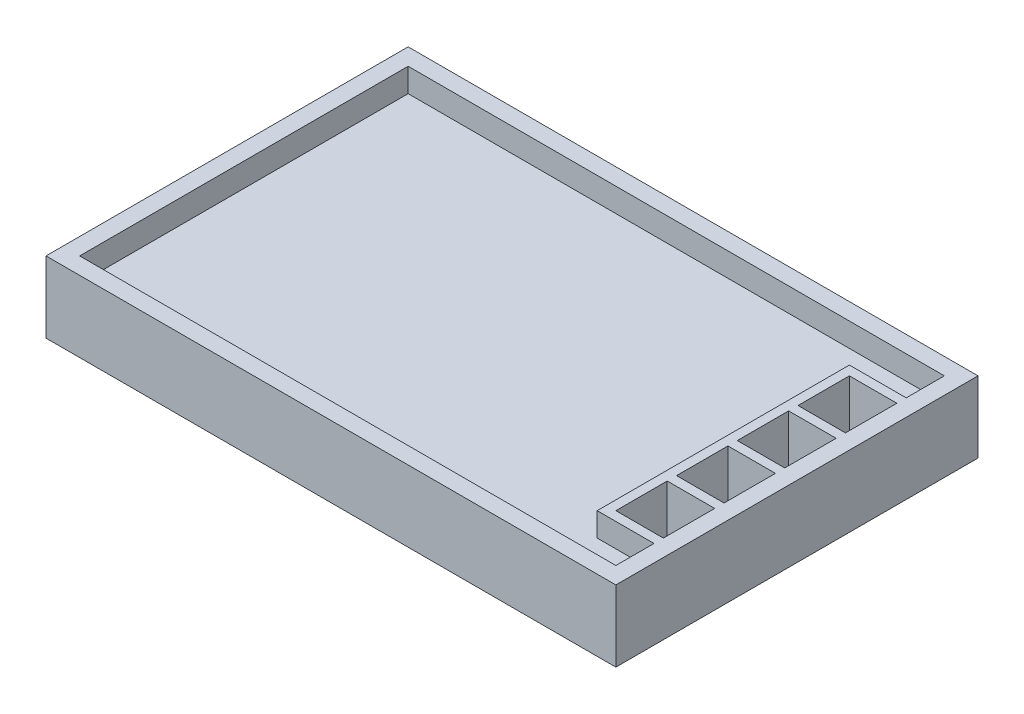
ISO-10303-21;
HEADER;
FILE_DESCRIPTION(('STEP AP214'),'2;1');
FILE_NAME('part.step','',(''),(''),'','','');
FILE_SCHEMA(('AUTOMOTIVE_DESIGN { 1 0 10303 214 1 1 1 1 }'));
ENDSEC;
DATA;
#1=APPLICATION_CONTEXT('core data for automotive mechanical design processes');
#2=APPLICATION_PROTOCOL_DEFINITION('international standard','automotive_design',2000,#1);
#3=PRODUCT_CONTEXT('',#1,'mechanical');
#4=PRODUCT('Part','Part','',(#3));
#5=PRODUCT_RELATED_PRODUCT_CATEGORY('part','',(#4));
#6=PRODUCT_DEFINITION_FORMATION('','',#4);
#7=PRODUCT_DEFINITION_CONTEXT('part definition',#1,'design');
#8=PRODUCT_DEFINITION('design','',#6,#7);
#9=PRODUCT_DEFINITION_SHAPE('','',#8);
#10=(LENGTH_UNIT() NAMED_UNIT(*) SI_UNIT(.MILLI.,.METRE.));
#11=(NAMED_UNIT(*) PLANE_ANGLE_UNIT() SI_UNIT($,.RADIAN.));
#12=(NAMED_UNIT(*) SI_UNIT($,.STERADIAN.) SOLID_ANGLE_UNIT());
#13=UNCERTAINTY_MEASURE_WITH_UNIT(LENGTH_MEASURE(1.E-05),#10,'distance_accuracy_value','');
#14=(GEOMETRIC_REPRESENTATION_CONTEXT(3) GLOBAL_UNCERTAINTY_ASSIGNED_CONTEXT((#13)) GLOBAL_UNIT_ASSIGNED_CONTEXT((#10,
#11,#12)) REPRESENTATION_CONTEXT('',''));
#15=CARTESIAN_POINT('',(0.,0.,0.));
#16=DIRECTION('',(0.,0.,1.));
#17=DIRECTION('',(1.,0.,0.));
#18=AXIS2_PLACEMENT_3D('',#15,#16,#17);
#19=CARTESIAN_POINT('',(319.157180973326,-723.480399595529,-250.416472916478));
#20=DIRECTION('',(1.,0.,0.));
#21=DIRECTION('',(0.,0.,-1.));
#22=AXIS2_PLACEMENT_3D('',#19,#20,#21);
#23=PLANE('',#22);
#24=DIRECTION('',(0.,-1.,0.));
#25=VECTOR('',#24,1.);
#26=CARTESIAN_POINT('',(319.157180973326,276.565869188517,-209.616472916478));
#27=LINE('',#26,#25);
#28=CARTESIAN_POINT('',(319.157180973326,0.,-209.616472916478));
#29=VERTEX_POINT('',#28);
#30=CARTESIAN_POINT('',(319.157180973326,-25.4,-209.616472916478));
#31=VERTEX_POINT('',#30);
#32=EDGE_CURVE('E305',#29,#31,#27,.T.);
#33=ORIENTED_EDGE('',*,*,#32,.F.);
#34=DIRECTION('',(0.,0.,-1.));
#35=VECTOR('',#34,1.);
#36=CARTESIAN_POINT('',(319.157180973326,0.,-250.416472916478));
#37=LINE('',#36,#35);
#38=CARTESIAN_POINT('',(319.157180973326,0.,-250.416472916478));
#39=VERTEX_POINT('',#38);
#40=EDGE_CURVE('E392',#29,#39,#37,.T.);
#41=ORIENTED_EDGE('',*,*,#40,.T.);
#42=DIRECTION('',(0.,1.,0.));
#43=VECTOR('',#42,1.);
#44=CARTESIAN_POINT('',(319.157180973326,-723.480399595529,-250.416472916478));
#45=LINE('',#44,#43);
#46=CARTESIAN_POINT('',(319.157180973326,-25.4,-250.416472916478));
#47=VERTEX_POINT('',#46);
#48=EDGE_CURVE('E409',#47,#39,#45,.T.);
#49=ORIENTED_EDGE('',*,*,#48,.F.);
#50=DIRECTION('',(0.,0.,1.));
#51=VECTOR('',#50,1.);
#52=CARTESIAN_POINT('',(319.157180973326,-25.4,-250.416472916478));
#53=LINE('',#52,#51);
#54=EDGE_CURVE('E374',#47,#31,#53,.T.);
#55=ORIENTED_EDGE('',*,*,#54,.T.);
#56=EDGE_LOOP('',(#33,#41,#49,#55));
#57=FACE_BOUND('',#56,.T.);
#58=ADVANCED_FACE('F37',(#57),#23,.F.);
#59=DIRECTION('',(0.,-1.,0.));
#60=VECTOR('',#59,1.);
#61=CARTESIAN_POINT('',(319.157180973326,276.565869188517,60.1835270835217));
#62=LINE('',#61,#60);
#63=CARTESIAN_POINT('',(319.157180973326,0.,60.1835270835217));
#64=VERTEX_POINT('',#63);
#65=CARTESIAN_POINT('',(319.157180973326,-25.4,60.1835270835217));
#66=VERTEX_POINT('',#65);
#67=EDGE_CURVE('E255',#64,#66,#62,.T.);
#68=ORIENTED_EDGE('',*,*,#67,.T.);
#69=CARTESIAN_POINT('',(319.157180973326,-25.4,100.983527083522));
#70=VERTEX_POINT('',#69);
#71=EDGE_CURVE('E41',#66,#70,#53,.T.);
#72=ORIENTED_EDGE('',*,*,#71,.T.);
#73=DIRECTION('',(0.,1.,0.));
#74=VECTOR('',#73,1.);
#75=CARTESIAN_POINT('',(319.157180973326,-723.480399595529,100.983527083522));
#76=LINE('',#75,#74);
#77=CARTESIAN_POINT('',(319.157180973326,0.,100.983527083522));
#78=VERTEX_POINT('',#77);
#79=EDGE_CURVE('E412',#70,#78,#76,.T.);
#80=ORIENTED_EDGE('',*,*,#79,.T.);
#81=EDGE_CURVE('E397',#78,#64,#37,.T.);
#82=ORIENTED_EDGE('',*,*,#81,.T.);
#83=EDGE_LOOP('',(#68,#72,#80,#82));
#84=FACE_BOUND('',#83,.T.);
#85=ADVANCED_FACE('F461',(#84),#23,.F.);
#86=DIRECTION('',(0.,1.,0.));
#87=VECTOR('',#86,1.);
#88=CARTESIAN_POINT('',(319.157180973326,-151.034099847596,50.1835270835217));
#89=LINE('',#88,#87);
#90=CARTESIAN_POINT('',(319.157180973326,-61.2,50.1835270835217));
#91=VERTEX_POINT('',#90);
#92=CARTESIAN_POINT('',(319.157180973326,0.,50.1835270835217));
#93=VERTEX_POINT('',#92);
#94=EDGE_CURVE('E318',#91,#93,#89,.T.);
#95=ORIENTED_EDGE('',*,*,#94,.T.);
#96=CARTESIAN_POINT('',(319.157180973326,0.,-4.76647291647828));
#97=VERTEX_POINT('',#96);
#98=EDGE_CURVE('E402',#93,#97,#37,.T.);
#99=ORIENTED_EDGE('',*,*,#98,.T.);
#100=DIRECTION('',(0.,1.,0.));
#101=VECTOR('',#100,1.);
#102=CARTESIAN_POINT('',(319.157180973326,-151.034099847596,-4.76647291647829));
#103=LINE('',#102,#101);
#104=CARTESIAN_POINT('',(319.157180973326,-61.2,-4.76647291647829));
#105=VERTEX_POINT('',#104);
#106=EDGE_CURVE('E261',#105,#97,#103,.T.);
#107=ORIENTED_EDGE('',*,*,#106,.F.);
#108=DIRECTION('',(0.,0.,1.));
#109=VECTOR('',#108,1.);
#110=CARTESIAN_POINT('',(319.157180973326,-61.2,-4.76647291647829));
#111=LINE('',#110,#109);
#112=EDGE_CURVE('E320',#105,#91,#111,.T.);
#113=ORIENTED_EDGE('',*,*,#112,.T.);
#114=EDGE_LOOP('',(#95,#99,#107,#113));
#115=FACE_BOUND('',#114,.T.);
#116=ADVANCED_FACE('F467',(#115),#23,.F.);
#117=DIRECTION('',(0.,1.,0.));
#118=VECTOR('',#117,1.);
#119=CARTESIAN_POINT('',(319.157180973326,-151.034099847596,-14.7664729164783));
#120=LINE('',#119,#118);
#121=CARTESIAN_POINT('',(319.157180973326,-61.2,-14.7664729164783));
#122=VERTEX_POINT('',#121);
#123=CARTESIAN_POINT('',(319.157180973326,0.,-14.7664729164783));
#124=VERTEX_POINT('',#123);
#125=EDGE_CURVE('E332',#122,#124,#120,.T.);
#126=ORIENTED_EDGE('',*,*,#125,.T.);
#127=CARTESIAN_POINT('',(319.157180973326,0.,-69.7164729164783));
#128=VERTEX_POINT('',#127);
#129=EDGE_CURVE('E395',#124,#128,#37,.T.);
#130=ORIENTED_EDGE('',*,*,#129,.T.);
#131=DIRECTION('',(0.,1.,0.));
#132=VECTOR('',#131,1.);
#133=CARTESIAN_POINT('',(319.157180973326,-151.034099847596,-69.7164729164783));
#134=LINE('',#133,#132);
#135=CARTESIAN_POINT('',(319.157180973326,-61.2,-69.7164729164783));
#136=VERTEX_POINT('',#135);
#137=EDGE_CURVE('E328',#136,#128,#134,.T.);
#138=ORIENTED_EDGE('',*,*,#137,.F.);
#139=DIRECTION('',(0.,0.,1.));
#140=VECTOR('',#139,1.);
#141=CARTESIAN_POINT('',(319.157180973326,-61.2,-69.7164729164783));
#142=LINE('',#141,#140);
#143=EDGE_CURVE('E334',#136,#122,#142,.T.);
#144=ORIENTED_EDGE('',*,*,#143,.T.);
#145=EDGE_LOOP('',(#126,#130,#138,#144));
#146=FACE_BOUND('',#145,.T.);
#147=ADVANCED_FACE('F481',(#146),#23,.F.);
#148=DIRECTION('',(0.,1.,0.));
#149=VECTOR('',#148,1.);
#150=CARTESIAN_POINT('',(319.157180973326,-151.034099847596,-79.7164729164783));
#151=LINE('',#150,#149);
#152=CARTESIAN_POINT('',(319.157180973326,-61.2,-79.7164729164783));
#153=VERTEX_POINT('',#152);
#154=CARTESIAN_POINT('',(319.157180973326,0.,-79.7164729164783));
#155=VERTEX_POINT('',#154);
#156=EDGE_CURVE('E348',#153,#155,#151,.T.);
#157=ORIENTED_EDGE('',*,*,#156,.T.);
#158=CARTESIAN_POINT('',(319.157180973326,0.,-134.666472916478));
#159=VERTEX_POINT('',#158);
#160=EDGE_CURVE('E391',#155,#159,#37,.T.);
#161=ORIENTED_EDGE('',*,*,#160,.T.);
#162=DIRECTION('',(0.,1.,0.));
#163=VECTOR('',#162,1.);
#164=CARTESIAN_POINT('',(319.157180973326,-151.034099847596,-134.666472916478));
#165=LINE('',#164,#163);
#166=CARTESIAN_POINT('',(319.157180973326,-61.2,-134.666472916478));
#167=VERTEX_POINT('',#166);
#168=EDGE_CURVE('E344',#167,#159,#165,.T.);
#169=ORIENTED_EDGE('',*,*,#168,.F.);
#170=DIRECTION('',(0.,0.,1.));
#171=VECTOR('',#170,1.);
#172=CARTESIAN_POINT('',(319.157180973326,-61.2,-134.666472916478));
#173=LINE('',#172,#171);
#174=EDGE_CURVE('E350',#167,#153,#173,.T.);
#175=ORIENTED_EDGE('',*,*,#174,.T.);
#176=EDGE_LOOP('',(#157,#161,#169,#175));
#177=FACE_BOUND('',#176,.T.);
#178=ADVANCED_FACE('F474',(#177),#23,.F.);
#179=DIRECTION('',(0.,1.,0.));
#180=VECTOR('',#179,1.);
#181=CARTESIAN_POINT('',(319.157180973326,-151.034099847596,-144.666472916478));
#182=LINE('',#181,#180);
#183=CARTESIAN_POINT('',(319.157180973326,-61.2,-144.666472916478));
#184=VERTEX_POINT('',#183);
#185=CARTESIAN_POINT('',(319.157180973326,0.,-144.666472916478));
#186=VERTEX_POINT('',#185);
#187=EDGE_CURVE('E362',#184,#186,#182,.T.);
#188=ORIENTED_EDGE('',*,*,#187,.T.);
#189=CARTESIAN_POINT('',(319.157180973326,0.,-199.616472916478));
#190=VERTEX_POINT('',#189);
#191=EDGE_CURVE('E386',#186,#190,#37,.T.);
#192=ORIENTED_EDGE('',*,*,#191,.T.);
#193=DIRECTION('',(0.,1.,0.));
#194=VECTOR('',#193,1.);
#195=CARTESIAN_POINT('',(319.157180973326,-151.034099847596,-199.616472916478));
#196=LINE('',#195,#194);
#197=CARTESIAN_POINT('',(319.157180973326,-61.2,-199.616472916478));
#198=VERTEX_POINT('',#197);
#199=EDGE_CURVE('E245',#198,#190,#196,.T.);
#200=ORIENTED_EDGE('',*,*,#199,.F.);
#201=DIRECTION('',(0.,0.,1.));
#202=VECTOR('',#201,1.);
#203=CARTESIAN_POINT('',(319.157180973326,-61.2,-199.616472916478));
#204=LINE('',#203,#202);
#205=EDGE_CURVE('E364',#198,#184,#204,.T.);
#206=ORIENTED_EDGE('',*,*,#205,.T.);
#207=EDGE_LOOP('',(#188,#192,#200,#206));
#208=FACE_BOUND('',#207,.T.);
#209=ADVANCED_FACE('F385',(#208),#23,.F.);
#210=CARTESIAN_POINT('',(0.,-25.4,0.));
#211=DIRECTION('',(0.,1.,0.));
#212=DIRECTION('',(0.,0.,1.));
#213=AXIS2_PLACEMENT_3D('',#210,#211,#212);
#214=PLANE('',#213);
#215=DIRECTION('',(0.,0.,1.));
#216=VECTOR('',#215,1.);
#217=CARTESIAN_POINT('',(258.357180973326,-25.4,-209.616472916478));
#218=LINE('',#217,#216);
#219=CARTESIAN_POINT('',(258.357180973326,-25.4,-209.616472916478));
#220=VERTEX_POINT('',#219);
#221=CARTESIAN_POINT('',(258.357180973326,-25.4,60.1835270835217));
#222=VERTEX_POINT('',#221);
#223=EDGE_CURVE('E309',#220,#222,#218,.T.);
#224=ORIENTED_EDGE('',*,*,#223,.F.);
#225=DIRECTION('',(-1.,0.,0.));
#226=VECTOR('',#225,1.);
#227=CARTESIAN_POINT('',(319.157180973326,-25.4,-209.616472916478));
#228=LINE('',#227,#226);
#229=EDGE_CURVE('E268',#31,#220,#228,.T.);
#230=ORIENTED_EDGE('',*,*,#229,.F.);
#231=ORIENTED_EDGE('',*,*,#54,.F.);
#232=DIRECTION('',(1.,0.,0.));
#233=VECTOR('',#232,1.);
#234=CARTESIAN_POINT('',(-254.442819026674,-25.4,-250.416472916478));
#235=LINE('',#234,#233);
#236=CARTESIAN_POINT('',(-254.442819026674,-25.4,-250.416472916478));
#237=VERTEX_POINT('',#236);
#238=EDGE_CURVE('E370',#237,#47,#235,.T.);
#239=ORIENTED_EDGE('',*,*,#238,.F.);
#240=DIRECTION('',(0.,0.,-1.));
#241=VECTOR('',#240,1.);
#242=CARTESIAN_POINT('',(-254.442819026674,-25.4,-250.416472916478));
#243=LINE('',#242,#241);
#244=CARTESIAN_POINT('',(-254.442819026674,-25.4,100.983527083522));
#245=VERTEX_POINT('',#244);
#246=EDGE_CURVE('E418',#245,#237,#243,.T.);
#247=ORIENTED_EDGE('',*,*,#246,.F.);
#248=DIRECTION('',(-1.,0.,0.));
#249=VECTOR('',#248,1.);
#250=CARTESIAN_POINT('',(-254.442819026674,-25.4,100.983527083522));
#251=LINE('',#250,#249);
#252=EDGE_CURVE('E415',#70,#245,#251,.T.);
#253=ORIENTED_EDGE('',*,*,#252,.F.);
#254=ORIENTED_EDGE('',*,*,#71,.F.);
#255=DIRECTION('',(1.,0.,0.));
#256=VECTOR('',#255,1.);
#257=CARTESIAN_POINT('',(258.357180973326,-25.4,60.1835270835217));
#258=LINE('',#257,#256);
#259=EDGE_CURVE('E312',#222,#66,#258,.T.);
#260=ORIENTED_EDGE('',*,*,#259,.F.);
#261=EDGE_LOOP('',(#224,#230,#231,#239,#247,#253,#254,#260));
#262=FACE_BOUND('',#261,.T.);
#263=ADVANCED_FACE('F473',(#262),#214,.T.);
#264=CARTESIAN_POINT('',(-272.442819026674,-76.2,-268.416472916478));
#265=DIRECTION('',(-1.,0.,0.));
#266=DIRECTION('',(0.,0.,1.));
#267=AXIS2_PLACEMENT_3D('',#264,#265,#266);
#268=PLANE('',#267);
#269=DIRECTION('',(0.,0.,1.));
#270=VECTOR('',#269,1.);
#271=CARTESIAN_POINT('',(-272.442819026674,0.,-268.416472916478));
#272=LINE('',#271,#270);
#273=CARTESIAN_POINT('',(-272.442819026674,0.,-268.416472916478));
#274=VERTEX_POINT('',#273);
#275=CARTESIAN_POINT('',(-272.442819026674,0.,118.983527083522));
#276=VERTEX_POINT('',#275);
#277=EDGE_CURVE('E417',#274,#276,#272,.T.);
#278=ORIENTED_EDGE('',*,*,#277,.F.);
#279=DIRECTION('',(0.,1.,0.));
#280=VECTOR('',#279,1.);
#281=CARTESIAN_POINT('',(-272.442819026674,-76.2,-268.416472916478));
#282=LINE('',#281,#280);
#283=CARTESIAN_POINT('',(-272.442819026674,-76.2,-268.416472916478));
#284=VERTEX_POINT('',#283);
#285=EDGE_CURVE('E12',#284,#274,#282,.T.);
#286=ORIENTED_EDGE('',*,*,#285,.F.);
#287=DIRECTION('',(0.,0.,1.));
#288=VECTOR('',#287,1.);
#289=CARTESIAN_POINT('',(-272.442819026674,-76.2,-268.416472916478));
#290=LINE('',#289,#288);
#291=CARTESIAN_POINT('',(-272.442819026674,-76.2,118.983527083522));
#292=VERTEX_POINT('',#291);
#293=EDGE_CURVE('E419',#284,#292,#290,.T.);
#294=ORIENTED_EDGE('',*,*,#293,.T.);
#295=DIRECTION('',(0.,1.,0.));
#296=VECTOR('',#295,1.);
#297=CARTESIAN_POINT('',(-272.442819026674,-76.2,118.983527083522));
#298=LINE('',#297,#296);
#299=EDGE_CURVE('E88',#292,#276,#298,.T.);
#300=ORIENTED_EDGE('',*,*,#299,.T.);
#301=EDGE_LOOP('',(#278,#286,#294,#300));
#302=FACE_BOUND('',#301,.T.);
#303=ADVANCED_FACE('F39',(#302),#268,.T.);
#304=CARTESIAN_POINT('',(-272.442819026674,-76.2,-268.416472916478));
#305=DIRECTION('',(0.,0.,-1.));
#306=DIRECTION('',(-1.,0.,0.));
#307=AXIS2_PLACEMENT_3D('',#304,#305,#306);
#308=PLANE('',#307);
#309=DIRECTION('',(-1.,0.,0.));
#310=VECTOR('',#309,1.);
#311=CARTESIAN_POINT('',(-272.442819026674,0.,-268.416472916478));
#312=LINE('',#311,#310);
#313=CARTESIAN_POINT('',(337.157180973326,0.,-268.416472916478));
#314=VERTEX_POINT('',#313);
#315=EDGE_CURVE('E422',#314,#274,#312,.T.);
#316=ORIENTED_EDGE('',*,*,#315,.F.);
#317=DIRECTION('',(0.,1.,0.));
#318=VECTOR('',#317,1.);
#319=CARTESIAN_POINT('',(337.157180973326,-76.2,-268.416472916478));
#320=LINE('',#319,#318);
#321=CARTESIAN_POINT('',(337.157180973326,-76.2,-268.416472916478));
#322=VERTEX_POINT('',#321);
#323=EDGE_CURVE('E47',#322,#314,#320,.T.);
#324=ORIENTED_EDGE('',*,*,#323,.F.);
#325=DIRECTION('',(-1.,0.,0.));
#326=VECTOR('',#325,1.);
#327=CARTESIAN_POINT('',(-272.442819026674,-76.2,-268.416472916478));
#328=LINE('',#327,#326);
#329=EDGE_CURVE('E427',#322,#284,#328,.T.);
#330=ORIENTED_EDGE('',*,*,#329,.T.);
#331=ORIENTED_EDGE('',*,*,#285,.T.);
#332=EDGE_LOOP('',(#316,#324,#330,#331));
#333=FACE_BOUND('',#332,.T.);
#334=ADVANCED_FACE('F443',(#333),#308,.T.);
#335=CARTESIAN_POINT('',(337.157180973326,-76.2,-268.416472916478));
#336=DIRECTION('',(1.,0.,0.));
#337=DIRECTION('',(0.,0.,-1.));
#338=AXIS2_PLACEMENT_3D('',#335,#336,#337);
#339=PLANE('',#338);
#340=DIRECTION('',(0.,0.,-1.));
#341=VECTOR('',#340,1.);
#342=CARTESIAN_POINT('',(337.157180973326,0.,-268.416472916478));
#343=LINE('',#342,#341);
#344=CARTESIAN_POINT('',(337.157180973326,0.,118.983527083522));
#345=VERTEX_POINT('',#344);
#346=EDGE_CURVE('E434',#345,#314,#343,.T.);
#347=ORIENTED_EDGE('',*,*,#346,.F.);
#348=DIRECTION('',(0.,1.,0.));
#349=VECTOR('',#348,1.);
#350=CARTESIAN_POINT('',(337.157180973326,-76.2,118.983527083522));
#351=LINE('',#350,#349);
#352=CARTESIAN_POINT('',(337.157180973326,-76.2,118.983527083522));
#353=VERTEX_POINT('',#352);
#354=EDGE_CURVE('E439',#353,#345,#351,.T.);
#355=ORIENTED_EDGE('',*,*,#354,.F.);
#356=DIRECTION('',(0.,0.,-1.));
#357=VECTOR('',#356,1.);
#358=CARTESIAN_POINT('',(337.157180973326,-76.2,-268.416472916478));
#359=LINE('',#358,#357);
#360=EDGE_CURVE('E424',#353,#322,#359,.T.);
#361=ORIENTED_EDGE('',*,*,#360,.T.);
#362=ORIENTED_EDGE('',*,*,#323,.T.);
#363=EDGE_LOOP('',(#347,#355,#361,#362));
#364=FACE_BOUND('',#363,.T.);
#365=ADVANCED_FACE('F447',(#364),#339,.T.);
#366=CARTESIAN_POINT('',(-272.442819026674,-76.2,118.983527083522));
#367=DIRECTION('',(0.,0.,1.));
#368=DIRECTION('',(1.,0.,0.));
#369=AXIS2_PLACEMENT_3D('',#366,#367,#368);
#370=PLANE('',#369);
#371=DIRECTION('',(1.,0.,0.));
#372=VECTOR('',#371,1.);
#373=CARTESIAN_POINT('',(-272.442819026674,0.,118.983527083522));
#374=LINE('',#373,#372);
#375=EDGE_CURVE('E431',#276,#345,#374,.T.);
#376=ORIENTED_EDGE('',*,*,#375,.F.);
#377=ORIENTED_EDGE('',*,*,#299,.F.);
#378=DIRECTION('',(1.,0.,0.));
#379=VECTOR('',#378,1.);
#380=CARTESIAN_POINT('',(-272.442819026674,-76.2,118.983527083522));
#381=LINE('',#380,#379);
#382=EDGE_CURVE('E421',#292,#353,#381,.T.);
#383=ORIENTED_EDGE('',*,*,#382,.T.);
#384=ORIENTED_EDGE('',*,*,#354,.T.);
#385=EDGE_LOOP('',(#376,#377,#383,#384));
#386=FACE_BOUND('',#385,.T.);
#387=ADVANCED_FACE('F441',(#386),#370,.T.);
#388=CARTESIAN_POINT('',(0.,-76.2,0.));
#389=DIRECTION('',(0.,1.,0.));
#390=DIRECTION('',(0.,0.,1.));
#391=AXIS2_PLACEMENT_3D('',#388,#389,#390);
#392=PLANE('',#391);
#393=ORIENTED_EDGE('',*,*,#293,.F.);
#394=ORIENTED_EDGE('',*,*,#329,.F.);
#395=ORIENTED_EDGE('',*,*,#360,.F.);
#396=ORIENTED_EDGE('',*,*,#382,.F.);
#397=EDGE_LOOP('',(#393,#394,#395,#396));
#398=FACE_BOUND('',#397,.T.);
#399=ADVANCED_FACE('F449',(#398),#392,.F.);
#400=CARTESIAN_POINT('',(0.,0.,0.));
#401=DIRECTION('',(0.,1.,0.));
#402=DIRECTION('',(0.,0.,1.));
#403=AXIS2_PLACEMENT_3D('',#400,#401,#402);
#404=PLANE('',#403);
#405=ORIENTED_EDGE('',*,*,#40,.F.);
#406=DIRECTION('',(-1.,0.,0.));
#407=VECTOR('',#406,1.);
#408=CARTESIAN_POINT('',(319.157180973326,0.,-209.616472916478));
#409=LINE('',#408,#407);
#410=CARTESIAN_POINT('',(258.357180973326,0.,-209.616472916478));
#411=VERTEX_POINT('',#410);
#412=EDGE_CURVE('E254',#29,#411,#409,.T.);
#413=ORIENTED_EDGE('',*,*,#412,.T.);
#414=DIRECTION('',(0.,0.,1.));
#415=VECTOR('',#414,1.);
#416=CARTESIAN_POINT('',(258.357180973326,0.,-209.616472916478));
#417=LINE('',#416,#415);
#418=CARTESIAN_POINT('',(258.357180973326,0.,60.1835270835217));
#419=VERTEX_POINT('',#418);
#420=EDGE_CURVE('E300',#411,#419,#417,.T.);
#421=ORIENTED_EDGE('',*,*,#420,.T.);
#422=DIRECTION('',(1.,0.,0.));
#423=VECTOR('',#422,1.);
#424=CARTESIAN_POINT('',(258.357180973326,0.,60.1835270835217));
#425=LINE('',#424,#423);
#426=EDGE_CURVE('E297',#419,#64,#425,.T.);
#427=ORIENTED_EDGE('',*,*,#426,.T.);
#428=ORIENTED_EDGE('',*,*,#81,.F.);
#429=DIRECTION('',(1.,0.,0.));
#430=VECTOR('',#429,1.);
#431=CARTESIAN_POINT('',(-254.442819026674,0.,100.983527083522));
#432=LINE('',#431,#430);
#433=CARTESIAN_POINT('',(-254.442819026674,0.,100.983527083522));
#434=VERTEX_POINT('',#433);
#435=EDGE_CURVE('E396',#434,#78,#432,.T.);
#436=ORIENTED_EDGE('',*,*,#435,.F.);
#437=DIRECTION('',(0.,0.,1.));
#438=VECTOR('',#437,1.);
#439=CARTESIAN_POINT('',(-254.442819026674,0.,-250.416472916478));
#440=LINE('',#439,#438);
#441=CARTESIAN_POINT('',(-254.442819026674,0.,-250.416472916478));
#442=VERTEX_POINT('',#441);
#443=EDGE_CURVE('E55',#442,#434,#440,.T.);
#444=ORIENTED_EDGE('',*,*,#443,.F.);
#445=DIRECTION('',(-1.,0.,0.));
#446=VECTOR('',#445,1.);
#447=CARTESIAN_POINT('',(-254.442819026674,0.,-250.416472916478));
#448=LINE('',#447,#446);
#449=EDGE_CURVE('E401',#39,#442,#448,.T.);
#450=ORIENTED_EDGE('',*,*,#449,.F.);
#451=EDGE_LOOP('',(#405,#413,#421,#427,#428,#436,#444,#450));
#452=FACE_BOUND('',#451,.T.);
#453=ORIENTED_EDGE('',*,*,#191,.F.);
#454=DIRECTION('',(-1.,0.,0.));
#455=VECTOR('',#454,1.);
#456=CARTESIAN_POINT('',(319.157180973326,0.,-144.666472916478));
#457=LINE('',#456,#455);
#458=CARTESIAN_POINT('',(268.357180973326,0.,-144.666472916478));
#459=VERTEX_POINT('',#458);
#460=EDGE_CURVE('E260',#186,#459,#457,.T.);
#461=ORIENTED_EDGE('',*,*,#460,.T.);
#462=DIRECTION('',(0.,0.,-1.));
#463=VECTOR('',#462,1.);
#464=CARTESIAN_POINT('',(268.357180973326,0.,-144.666472916478));
#465=LINE('',#464,#463);
#466=CARTESIAN_POINT('',(268.357180973326,0.,-199.616472916478));
#467=VERTEX_POINT('',#466);
#468=EDGE_CURVE('E238',#459,#467,#465,.T.);
#469=ORIENTED_EDGE('',*,*,#468,.T.);
#470=DIRECTION('',(1.,0.,0.));
#471=VECTOR('',#470,1.);
#472=CARTESIAN_POINT('',(268.357180973326,0.,-199.616472916478));
#473=LINE('',#472,#471);
#474=EDGE_CURVE('E248',#467,#190,#473,.T.);
#475=ORIENTED_EDGE('',*,*,#474,.T.);
#476=EDGE_LOOP('',(#453,#461,#469,#475));
#477=FACE_BOUND('',#476,.T.);
#478=ORIENTED_EDGE('',*,*,#160,.F.);
#479=DIRECTION('',(-1.,0.,0.));
#480=VECTOR('',#479,1.);
#481=CARTESIAN_POINT('',(319.157180973326,0.,-79.7164729164783));
#482=LINE('',#481,#480);
#483=CARTESIAN_POINT('',(268.357180973326,0.,-79.7164729164783));
#484=VERTEX_POINT('',#483);
#485=EDGE_CURVE('E276',#155,#484,#482,.T.);
#486=ORIENTED_EDGE('',*,*,#485,.T.);
#487=DIRECTION('',(0.,0.,-1.));
#488=VECTOR('',#487,1.);
#489=CARTESIAN_POINT('',(268.357180973326,0.,-79.7164729164783));
#490=LINE('',#489,#488);
#491=CARTESIAN_POINT('',(268.357180973326,0.,-134.666472916478));
#492=VERTEX_POINT('',#491);
#493=EDGE_CURVE('E273',#484,#492,#490,.T.);
#494=ORIENTED_EDGE('',*,*,#493,.T.);
#495=DIRECTION('',(1.,0.,0.));
#496=VECTOR('',#495,1.);
#497=CARTESIAN_POINT('',(268.357180973326,0.,-134.666472916478));
#498=LINE('',#497,#496);
#499=EDGE_CURVE('E265',#492,#159,#498,.T.);
#500=ORIENTED_EDGE('',*,*,#499,.T.);
#501=EDGE_LOOP('',(#478,#486,#494,#500));
#502=FACE_BOUND('',#501,.T.);
#503=ORIENTED_EDGE('',*,*,#129,.F.);
#504=DIRECTION('',(-1.,0.,0.));
#505=VECTOR('',#504,1.);
#506=CARTESIAN_POINT('',(319.157180973326,0.,-14.7664729164783));
#507=LINE('',#506,#505);
#508=CARTESIAN_POINT('',(268.357180973326,0.,-14.7664729164783));
#509=VERTEX_POINT('',#508);
#510=EDGE_CURVE('E285',#124,#509,#507,.T.);
#511=ORIENTED_EDGE('',*,*,#510,.T.);
#512=DIRECTION('',(0.,0.,-1.));
#513=VECTOR('',#512,1.);
#514=CARTESIAN_POINT('',(268.357180973326,0.,-14.7664729164783));
#515=LINE('',#514,#513);
#516=CARTESIAN_POINT('',(268.357180973326,0.,-69.7164729164783));
#517=VERTEX_POINT('',#516);
#518=EDGE_CURVE('E282',#509,#517,#515,.T.);
#519=ORIENTED_EDGE('',*,*,#518,.T.);
#520=DIRECTION('',(1.,0.,0.));
#521=VECTOR('',#520,1.);
#522=CARTESIAN_POINT('',(268.357180973326,0.,-69.7164729164783));
#523=LINE('',#522,#521);
#524=EDGE_CURVE('E279',#517,#128,#523,.T.);
#525=ORIENTED_EDGE('',*,*,#524,.T.);
#526=EDGE_LOOP('',(#503,#511,#519,#525));
#527=FACE_BOUND('',#526,.T.);
#528=DIRECTION('',(1.,0.,0.));
#529=VECTOR('',#528,1.);
#530=CARTESIAN_POINT('',(268.357180973326,0.,-4.76647291647828));
#531=LINE('',#530,#529);
#532=CARTESIAN_POINT('',(268.357180973326,0.,-4.76647291647828));
#533=VERTEX_POINT('',#532);
#534=EDGE_CURVE('E288',#533,#97,#531,.T.);
#535=ORIENTED_EDGE('',*,*,#534,.T.);
#536=ORIENTED_EDGE('',*,*,#98,.F.);
#537=DIRECTION('',(-1.,0.,0.));
#538=VECTOR('',#537,1.);
#539=CARTESIAN_POINT('',(319.157180973326,0.,50.1835270835217));
#540=LINE('',#539,#538);
#541=CARTESIAN_POINT('',(268.357180973326,0.,50.1835270835217));
#542=VERTEX_POINT('',#541);
#543=EDGE_CURVE('E294',#93,#542,#540,.T.);
#544=ORIENTED_EDGE('',*,*,#543,.T.);
#545=DIRECTION('',(0.,0.,-1.));
#546=VECTOR('',#545,1.);
#547=CARTESIAN_POINT('',(268.357180973326,0.,50.1835270835217));
#548=LINE('',#547,#546);
#549=EDGE_CURVE('E291',#542,#533,#548,.T.);
#550=ORIENTED_EDGE('',*,*,#549,.T.);
#551=EDGE_LOOP('',(#535,#536,#544,#550));
#552=FACE_BOUND('',#551,.T.);
#553=ORIENTED_EDGE('',*,*,#277,.T.);
#554=ORIENTED_EDGE('',*,*,#375,.T.);
#555=ORIENTED_EDGE('',*,*,#346,.T.);
#556=ORIENTED_EDGE('',*,*,#315,.T.);
#557=EDGE_LOOP('',(#553,#554,#555,#556));
#558=FACE_BOUND('',#557,.T.);
#559=ADVANCED_FACE('F257',(#452,#477,#502,#527,#552,#558),#404,.T.);
#560=CARTESIAN_POINT('',(-254.442819026674,-723.480399595529,-250.416472916478));
#561=DIRECTION('',(-1.,0.,0.));
#562=DIRECTION('',(0.,0.,1.));
#563=AXIS2_PLACEMENT_3D('',#560,#561,#562);
#564=PLANE('',#563);
#565=ORIENTED_EDGE('',*,*,#246,.T.);
#566=DIRECTION('',(0.,1.,0.));
#567=VECTOR('',#566,1.);
#568=CARTESIAN_POINT('',(-254.442819026674,-723.480399595529,-250.416472916478));
#569=LINE('',#568,#567);
#570=EDGE_CURVE('E407',#237,#442,#569,.T.);
#571=ORIENTED_EDGE('',*,*,#570,.T.);
#572=ORIENTED_EDGE('',*,*,#443,.T.);
#573=DIRECTION('',(0.,1.,0.));
#574=VECTOR('',#573,1.);
#575=CARTESIAN_POINT('',(-254.442819026674,-723.480399595529,100.983527083522));
#576=LINE('',#575,#574);
#577=EDGE_CURVE('E406',#245,#434,#576,.T.);
#578=ORIENTED_EDGE('',*,*,#577,.F.);
#579=EDGE_LOOP('',(#565,#571,#572,#578));
#580=FACE_BOUND('',#579,.T.);
#581=ADVANCED_FACE('F456',(#580),#564,.F.);
#582=CARTESIAN_POINT('',(-254.442819026674,-723.480399595529,-250.416472916478));
#583=DIRECTION('',(0.,0.,-1.));
#584=DIRECTION('',(-1.,0.,0.));
#585=AXIS2_PLACEMENT_3D('',#582,#583,#584);
#586=PLANE('',#585);
#587=ORIENTED_EDGE('',*,*,#238,.T.);
#588=ORIENTED_EDGE('',*,*,#48,.T.);
#589=ORIENTED_EDGE('',*,*,#449,.T.);
#590=ORIENTED_EDGE('',*,*,#570,.F.);
#591=EDGE_LOOP('',(#587,#588,#589,#590));
#592=FACE_BOUND('',#591,.T.);
#593=ADVANCED_FACE('F528',(#592),#586,.F.);
#594=CARTESIAN_POINT('',(-254.442819026674,-723.480399595529,100.983527083522));
#595=DIRECTION('',(0.,0.,1.));
#596=DIRECTION('',(1.,0.,0.));
#597=AXIS2_PLACEMENT_3D('',#594,#595,#596);
#598=PLANE('',#597);
#599=ORIENTED_EDGE('',*,*,#252,.T.);
#600=ORIENTED_EDGE('',*,*,#577,.T.);
#601=ORIENTED_EDGE('',*,*,#435,.T.);
#602=ORIENTED_EDGE('',*,*,#79,.F.);
#603=EDGE_LOOP('',(#599,#600,#601,#602));
#604=FACE_BOUND('',#603,.T.);
#605=ADVANCED_FACE('F524',(#604),#598,.F.);
#606=CARTESIAN_POINT('',(319.157180973326,-151.034099847596,-144.666472916478));
#607=DIRECTION('',(0.,0.,1.));
#608=DIRECTION('',(1.,0.,0.));
#609=AXIS2_PLACEMENT_3D('',#606,#607,#608);
#610=PLANE('',#609);
#611=DIRECTION('',(-1.,0.,0.));
#612=VECTOR('',#611,1.);
#613=CARTESIAN_POINT('',(319.157180973326,-61.2,-144.666472916478));
#614=LINE('',#613,#612);
#615=CARTESIAN_POINT('',(268.357180973326,-61.2,-144.666472916478));
#616=VERTEX_POINT('',#615);
#617=EDGE_CURVE('E361',#184,#616,#614,.T.);
#618=ORIENTED_EDGE('',*,*,#617,.T.);
#619=DIRECTION('',(0.,1.,0.));
#620=VECTOR('',#619,1.);
#621=CARTESIAN_POINT('',(268.357180973326,-151.034099847596,-144.666472916478));
#622=LINE('',#621,#620);
#623=EDGE_CURVE('E244',#616,#459,#622,.T.);
#624=ORIENTED_EDGE('',*,*,#623,.T.);
#625=ORIENTED_EDGE('',*,*,#460,.F.);
#626=ORIENTED_EDGE('',*,*,#187,.F.);
#627=EDGE_LOOP('',(#618,#624,#625,#626));
#628=FACE_BOUND('',#627,.T.);
#629=ADVANCED_FACE('F390',(#628),#610,.F.);
#630=CARTESIAN_POINT('',(268.357180973326,-151.034099847596,-199.616472916478));
#631=DIRECTION('',(-1.,0.,0.));
#632=DIRECTION('',(0.,0.,1.));
#633=AXIS2_PLACEMENT_3D('',#630,#631,#632);
#634=PLANE('',#633);
#635=DIRECTION('',(0.,0.,-1.));
#636=VECTOR('',#635,1.);
#637=CARTESIAN_POINT('',(268.357180973326,-61.2,-199.616472916478));
#638=LINE('',#637,#636);
#639=CARTESIAN_POINT('',(268.357180973326,-61.2,-199.616472916478));
#640=VERTEX_POINT('',#639);
#641=EDGE_CURVE('E241',#616,#640,#638,.T.);
#642=ORIENTED_EDGE('',*,*,#641,.T.);
#643=DIRECTION('',(0.,1.,0.));
#644=VECTOR('',#643,1.);
#645=CARTESIAN_POINT('',(268.357180973326,-151.034099847596,-199.616472916478));
#646=LINE('',#645,#644);
#647=EDGE_CURVE('E233',#640,#467,#646,.T.);
#648=ORIENTED_EDGE('',*,*,#647,.T.);
#649=ORIENTED_EDGE('',*,*,#468,.F.);
#650=ORIENTED_EDGE('',*,*,#623,.F.);
#651=EDGE_LOOP('',(#642,#648,#649,#650));
#652=FACE_BOUND('',#651,.T.);
#653=ADVANCED_FACE('F235',(#652),#634,.F.);
#654=CARTESIAN_POINT('',(319.157180973326,-151.034099847596,-199.616472916478));
#655=DIRECTION('',(0.,0.,-1.));
#656=DIRECTION('',(-1.,0.,0.));
#657=AXIS2_PLACEMENT_3D('',#654,#655,#656);
#658=PLANE('',#657);
#659=DIRECTION('',(1.,0.,0.));
#660=VECTOR('',#659,1.);
#661=CARTESIAN_POINT('',(319.157180973326,-61.2,-199.616472916478));
#662=LINE('',#661,#660);
#663=EDGE_CURVE('E366',#640,#198,#662,.T.);
#664=ORIENTED_EDGE('',*,*,#663,.T.);
#665=ORIENTED_EDGE('',*,*,#199,.T.);
#666=ORIENTED_EDGE('',*,*,#474,.F.);
#667=ORIENTED_EDGE('',*,*,#647,.F.);
#668=EDGE_LOOP('',(#664,#665,#666,#667));
#669=FACE_BOUND('',#668,.T.);
#670=ADVANCED_FACE('F249',(#669),#658,.F.);
#671=CARTESIAN_POINT('',(0.,-61.2,0.));
#672=DIRECTION('',(0.,1.,0.));
#673=DIRECTION('',(0.,0.,1.));
#674=AXIS2_PLACEMENT_3D('',#671,#672,#673);
#675=PLANE('',#674);
#676=ORIENTED_EDGE('',*,*,#205,.F.);
#677=ORIENTED_EDGE('',*,*,#663,.F.);
#678=ORIENTED_EDGE('',*,*,#641,.F.);
#679=ORIENTED_EDGE('',*,*,#617,.F.);
#680=EDGE_LOOP('',(#676,#677,#678,#679));
#681=FACE_BOUND('',#680,.T.);
#682=ADVANCED_FACE('F515',(#681),#675,.T.);
#683=CARTESIAN_POINT('',(319.157180973326,-151.034099847596,-79.7164729164783));
#684=DIRECTION('',(0.,0.,1.));
#685=DIRECTION('',(1.,0.,0.));
#686=AXIS2_PLACEMENT_3D('',#683,#684,#685);
#687=PLANE('',#686);
#688=DIRECTION('',(-1.,0.,0.));
#689=VECTOR('',#688,1.);
#690=CARTESIAN_POINT('',(319.157180973326,-61.2,-79.7164729164783));
#691=LINE('',#690,#689);
#692=CARTESIAN_POINT('',(268.357180973326,-61.2,-79.7164729164783));
#693=VERTEX_POINT('',#692);
#694=EDGE_CURVE('E347',#153,#693,#691,.T.);
#695=ORIENTED_EDGE('',*,*,#694,.T.);
#696=DIRECTION('',(0.,1.,0.));
#697=VECTOR('',#696,1.);
#698=CARTESIAN_POINT('',(268.357180973326,-151.034099847596,-79.7164729164783));
#699=LINE('',#698,#697);
#700=EDGE_CURVE('E354',#693,#484,#699,.T.);
#701=ORIENTED_EDGE('',*,*,#700,.T.);
#702=ORIENTED_EDGE('',*,*,#485,.F.);
#703=ORIENTED_EDGE('',*,*,#156,.F.);
#704=EDGE_LOOP('',(#695,#701,#702,#703));
#705=FACE_BOUND('',#704,.T.);
#706=ADVANCED_FACE('F494',(#705),#687,.F.);
#707=CARTESIAN_POINT('',(268.357180973326,-151.034099847596,-134.666472916478));
#708=DIRECTION('',(-1.,0.,0.));
#709=DIRECTION('',(0.,0.,1.));
#710=AXIS2_PLACEMENT_3D('',#707,#708,#709);
#711=PLANE('',#710);
#712=DIRECTION('',(0.,0.,-1.));
#713=VECTOR('',#712,1.);
#714=CARTESIAN_POINT('',(268.357180973326,-61.2,-134.666472916478));
#715=LINE('',#714,#713);
#716=CARTESIAN_POINT('',(268.357180973326,-61.2,-134.666472916478));
#717=VERTEX_POINT('',#716);
#718=EDGE_CURVE('E345',#693,#717,#715,.T.);
#719=ORIENTED_EDGE('',*,*,#718,.T.);
#720=DIRECTION('',(0.,1.,0.));
#721=VECTOR('',#720,1.);
#722=CARTESIAN_POINT('',(268.357180973326,-151.034099847596,-134.666472916478));
#723=LINE('',#722,#721);
#724=EDGE_CURVE('E356',#717,#492,#723,.T.);
#725=ORIENTED_EDGE('',*,*,#724,.T.);
#726=ORIENTED_EDGE('',*,*,#493,.F.);
#727=ORIENTED_EDGE('',*,*,#700,.F.);
#728=EDGE_LOOP('',(#719,#725,#726,#727));
#729=FACE_BOUND('',#728,.T.);
#730=ADVANCED_FACE('F507',(#729),#711,.F.);
#731=CARTESIAN_POINT('',(319.157180973326,-151.034099847596,-134.666472916478));
#732=DIRECTION('',(0.,0.,-1.));
#733=DIRECTION('',(-1.,0.,0.));
#734=AXIS2_PLACEMENT_3D('',#731,#732,#733);
#735=PLANE('',#734);
#736=DIRECTION('',(1.,0.,0.));
#737=VECTOR('',#736,1.);
#738=CARTESIAN_POINT('',(319.157180973326,-61.2,-134.666472916478));
#739=LINE('',#738,#737);
#740=EDGE_CURVE('E352',#717,#167,#739,.T.);
#741=ORIENTED_EDGE('',*,*,#740,.T.);
#742=ORIENTED_EDGE('',*,*,#168,.T.);
#743=ORIENTED_EDGE('',*,*,#499,.F.);
#744=ORIENTED_EDGE('',*,*,#724,.F.);
#745=EDGE_LOOP('',(#741,#742,#743,#744));
#746=FACE_BOUND('',#745,.T.);
#747=ADVANCED_FACE('F501',(#746),#735,.F.);
#748=CARTESIAN_POINT('',(0.,-61.2,0.));
#749=DIRECTION('',(0.,1.,0.));
#750=DIRECTION('',(0.,0.,1.));
#751=AXIS2_PLACEMENT_3D('',#748,#749,#750);
#752=PLANE('',#751);
#753=ORIENTED_EDGE('',*,*,#174,.F.);
#754=ORIENTED_EDGE('',*,*,#740,.F.);
#755=ORIENTED_EDGE('',*,*,#718,.F.);
#756=ORIENTED_EDGE('',*,*,#694,.F.);
#757=EDGE_LOOP('',(#753,#754,#755,#756));
#758=FACE_BOUND('',#757,.T.);
#759=ADVANCED_FACE('F505',(#758),#752,.T.);
#760=CARTESIAN_POINT('',(319.157180973326,-151.034099847596,-14.7664729164783));
#761=DIRECTION('',(0.,0.,1.));
#762=DIRECTION('',(1.,0.,0.));
#763=AXIS2_PLACEMENT_3D('',#760,#761,#762);
#764=PLANE('',#763);
#765=DIRECTION('',(-1.,0.,0.));
#766=VECTOR('',#765,1.);
#767=CARTESIAN_POINT('',(319.157180973326,-61.2,-14.7664729164783));
#768=LINE('',#767,#766);
#769=CARTESIAN_POINT('',(268.357180973326,-61.2,-14.7664729164783));
#770=VERTEX_POINT('',#769);
#771=EDGE_CURVE('E331',#122,#770,#768,.T.);
#772=ORIENTED_EDGE('',*,*,#771,.T.);
#773=DIRECTION('',(0.,1.,0.));
#774=VECTOR('',#773,1.);
#775=CARTESIAN_POINT('',(268.357180973326,-151.034099847596,-14.7664729164783));
#776=LINE('',#775,#774);
#777=EDGE_CURVE('E338',#770,#509,#776,.T.);
#778=ORIENTED_EDGE('',*,*,#777,.T.);
#779=ORIENTED_EDGE('',*,*,#510,.F.);
#780=ORIENTED_EDGE('',*,*,#125,.F.);
#781=EDGE_LOOP('',(#772,#778,#779,#780));
#782=FACE_BOUND('',#781,.T.);
#783=ADVANCED_FACE('F592',(#782),#764,.F.);
#784=CARTESIAN_POINT('',(268.357180973326,-151.034099847596,-69.7164729164783));
#785=DIRECTION('',(-1.,0.,0.));
#786=DIRECTION('',(0.,0.,1.));
#787=AXIS2_PLACEMENT_3D('',#784,#785,#786);
#788=PLANE('',#787);
#789=DIRECTION('',(0.,0.,-1.));
#790=VECTOR('',#789,1.);
#791=CARTESIAN_POINT('',(268.357180973326,-61.2,-69.7164729164783));
#792=LINE('',#791,#790);
#793=CARTESIAN_POINT('',(268.357180973326,-61.2,-69.7164729164783));
#794=VERTEX_POINT('',#793);
#795=EDGE_CURVE('E329',#770,#794,#792,.T.);
#796=ORIENTED_EDGE('',*,*,#795,.T.);
#797=DIRECTION('',(0.,1.,0.));
#798=VECTOR('',#797,1.);
#799=CARTESIAN_POINT('',(268.357180973326,-151.034099847596,-69.7164729164783));
#800=LINE('',#799,#798);
#801=EDGE_CURVE('E340',#794,#517,#800,.T.);
#802=ORIENTED_EDGE('',*,*,#801,.T.);
#803=ORIENTED_EDGE('',*,*,#518,.F.);
#804=ORIENTED_EDGE('',*,*,#777,.F.);
#805=EDGE_LOOP('',(#796,#802,#803,#804));
#806=FACE_BOUND('',#805,.T.);
#807=ADVANCED_FACE('F595',(#806),#788,.F.);
#808=CARTESIAN_POINT('',(319.157180973326,-151.034099847596,-69.7164729164783));
#809=DIRECTION('',(0.,0.,-1.));
#810=DIRECTION('',(-1.,0.,0.));
#811=AXIS2_PLACEMENT_3D('',#808,#809,#810);
#812=PLANE('',#811);
#813=DIRECTION('',(1.,0.,0.));
#814=VECTOR('',#813,1.);
#815=CARTESIAN_POINT('',(319.157180973326,-61.2,-69.7164729164783));
#816=LINE('',#815,#814);
#817=EDGE_CURVE('E336',#794,#136,#816,.T.);
#818=ORIENTED_EDGE('',*,*,#817,.T.);
#819=ORIENTED_EDGE('',*,*,#137,.T.);
#820=ORIENTED_EDGE('',*,*,#524,.F.);
#821=ORIENTED_EDGE('',*,*,#801,.F.);
#822=EDGE_LOOP('',(#818,#819,#820,#821));
#823=FACE_BOUND('',#822,.T.);
#824=ADVANCED_FACE('F590',(#823),#812,.F.);
#825=CARTESIAN_POINT('',(0.,-61.2,0.));
#826=DIRECTION('',(0.,1.,0.));
#827=DIRECTION('',(0.,0.,1.));
#828=AXIS2_PLACEMENT_3D('',#825,#826,#827);
#829=PLANE('',#828);
#830=ORIENTED_EDGE('',*,*,#143,.F.);
#831=ORIENTED_EDGE('',*,*,#817,.F.);
#832=ORIENTED_EDGE('',*,*,#795,.F.);
#833=ORIENTED_EDGE('',*,*,#771,.F.);
#834=EDGE_LOOP('',(#830,#831,#832,#833));
#835=FACE_BOUND('',#834,.T.);
#836=ADVANCED_FACE('F580',(#835),#829,.T.);
#837=CARTESIAN_POINT('',(319.157180973326,-151.034099847596,50.1835270835217));
#838=DIRECTION('',(0.,0.,1.));
#839=DIRECTION('',(1.,0.,0.));
#840=AXIS2_PLACEMENT_3D('',#837,#838,#839);
#841=PLANE('',#840);
#842=DIRECTION('',(-1.,0.,0.));
#843=VECTOR('',#842,1.);
#844=CARTESIAN_POINT('',(319.157180973326,-61.2,50.1835270835217));
#845=LINE('',#844,#843);
#846=CARTESIAN_POINT('',(268.357180973326,-61.2,50.1835270835217));
#847=VERTEX_POINT('',#846);
#848=EDGE_CURVE('E317',#91,#847,#845,.T.);
#849=ORIENTED_EDGE('',*,*,#848,.T.);
#850=DIRECTION('',(0.,1.,0.));
#851=VECTOR('',#850,1.);
#852=CARTESIAN_POINT('',(268.357180973326,-151.034099847596,50.1835270835217));
#853=LINE('',#852,#851);
#854=EDGE_CURVE('E324',#847,#542,#853,.T.);
#855=ORIENTED_EDGE('',*,*,#854,.T.);
#856=ORIENTED_EDGE('',*,*,#543,.F.);
#857=ORIENTED_EDGE('',*,*,#94,.F.);
#858=EDGE_LOOP('',(#849,#855,#856,#857));
#859=FACE_BOUND('',#858,.T.);
#860=ADVANCED_FACE('F576',(#859),#841,.F.);
#861=CARTESIAN_POINT('',(268.357180973326,-151.034099847596,-4.76647291647828));
#862=DIRECTION('',(-1.,0.,0.));
#863=DIRECTION('',(0.,0.,1.));
#864=AXIS2_PLACEMENT_3D('',#861,#862,#863);
#865=PLANE('',#864);
#866=DIRECTION('',(0.,0.,-1.));
#867=VECTOR('',#866,1.);
#868=CARTESIAN_POINT('',(268.357180973326,-61.2,-4.76647291647828));
#869=LINE('',#868,#867);
#870=CARTESIAN_POINT('',(268.357180973326,-61.2,-4.76647291647828));
#871=VERTEX_POINT('',#870);
#872=EDGE_CURVE('E315',#847,#871,#869,.T.);
#873=ORIENTED_EDGE('',*,*,#872,.T.);
#874=DIRECTION('',(0.,1.,0.));
#875=VECTOR('',#874,1.);
#876=CARTESIAN_POINT('',(268.357180973326,-151.034099847596,-4.76647291647828));
#877=LINE('',#876,#875);
#878=EDGE_CURVE('E263',#871,#533,#877,.T.);
#879=ORIENTED_EDGE('',*,*,#878,.T.);
#880=ORIENTED_EDGE('',*,*,#549,.F.);
#881=ORIENTED_EDGE('',*,*,#854,.F.);
#882=EDGE_LOOP('',(#873,#879,#880,#881));
#883=FACE_BOUND('',#882,.T.);
#884=ADVANCED_FACE('F579',(#883),#865,.F.);
#885=CARTESIAN_POINT('',(319.157180973326,-151.034099847596,-4.76647291647829));
#886=DIRECTION('',(0.,0.,-1.));
#887=DIRECTION('',(-1.,0.,0.));
#888=AXIS2_PLACEMENT_3D('',#885,#886,#887);
#889=PLANE('',#888);
#890=DIRECTION('',(1.,0.,0.));
#891=VECTOR('',#890,1.);
#892=CARTESIAN_POINT('',(319.157180973326,-61.2,-4.76647291647829));
#893=LINE('',#892,#891);
#894=EDGE_CURVE('E322',#871,#105,#893,.T.);
#895=ORIENTED_EDGE('',*,*,#894,.T.);
#896=ORIENTED_EDGE('',*,*,#106,.T.);
#897=ORIENTED_EDGE('',*,*,#534,.F.);
#898=ORIENTED_EDGE('',*,*,#878,.F.);
#899=EDGE_LOOP('',(#895,#896,#897,#898));
#900=FACE_BOUND('',#899,.T.);
#901=ADVANCED_FACE('F571',(#900),#889,.F.);
#902=CARTESIAN_POINT('',(0.,-61.2,0.));
#903=DIRECTION('',(0.,1.,0.));
#904=DIRECTION('',(0.,0.,1.));
#905=AXIS2_PLACEMENT_3D('',#902,#903,#904);
#906=PLANE('',#905);
#907=ORIENTED_EDGE('',*,*,#112,.F.);
#908=ORIENTED_EDGE('',*,*,#894,.F.);
#909=ORIENTED_EDGE('',*,*,#872,.F.);
#910=ORIENTED_EDGE('',*,*,#848,.F.);
#911=EDGE_LOOP('',(#907,#908,#909,#910));
#912=FACE_BOUND('',#911,.T.);
#913=ADVANCED_FACE('F564',(#912),#906,.T.);
#914=CARTESIAN_POINT('',(319.157180973326,276.565869188517,-209.616472916478));
#915=DIRECTION('',(0.,0.,1.));
#916=DIRECTION('',(1.,0.,0.));
#917=AXIS2_PLACEMENT_3D('',#914,#915,#916);
#918=PLANE('',#917);
#919=ORIENTED_EDGE('',*,*,#412,.F.);
#920=ORIENTED_EDGE('',*,*,#32,.T.);
#921=ORIENTED_EDGE('',*,*,#229,.T.);
#922=DIRECTION('',(0.,-1.,0.));
#923=VECTOR('',#922,1.);
#924=CARTESIAN_POINT('',(258.357180973326,276.565869188517,-209.616472916478));
#925=LINE('',#924,#923);
#926=EDGE_CURVE('E307',#411,#220,#925,.T.);
#927=ORIENTED_EDGE('',*,*,#926,.F.);
#928=EDGE_LOOP('',(#919,#920,#921,#927));
#929=FACE_BOUND('',#928,.T.);
#930=ADVANCED_FACE('F561',(#929),#918,.F.);
#931=CARTESIAN_POINT('',(258.357180973326,276.565869188517,-209.616472916478));
#932=DIRECTION('',(1.,0.,0.));
#933=DIRECTION('',(0.,0.,-1.));
#934=AXIS2_PLACEMENT_3D('',#931,#932,#933);
#935=PLANE('',#934);
#936=ORIENTED_EDGE('',*,*,#420,.F.);
#937=ORIENTED_EDGE('',*,*,#926,.T.);
#938=ORIENTED_EDGE('',*,*,#223,.T.);
#939=DIRECTION('',(0.,-1.,0.));
#940=VECTOR('',#939,1.);
#941=CARTESIAN_POINT('',(258.357180973326,276.565869188517,60.1835270835217));
#942=LINE('',#941,#940);
#943=EDGE_CURVE('E310',#419,#222,#942,.T.);
#944=ORIENTED_EDGE('',*,*,#943,.F.);
#945=EDGE_LOOP('',(#936,#937,#938,#944));
#946=FACE_BOUND('',#945,.T.);
#947=ADVANCED_FACE('F558',(#946),#935,.F.);
#948=CARTESIAN_POINT('',(258.357180973326,276.565869188517,60.1835270835217));
#949=DIRECTION('',(0.,0.,-1.));
#950=DIRECTION('',(-1.,0.,0.));
#951=AXIS2_PLACEMENT_3D('',#948,#949,#950);
#952=PLANE('',#951);
#953=ORIENTED_EDGE('',*,*,#426,.F.);
#954=ORIENTED_EDGE('',*,*,#943,.T.);
#955=ORIENTED_EDGE('',*,*,#259,.T.);
#956=ORIENTED_EDGE('',*,*,#67,.F.);
#957=EDGE_LOOP('',(#953,#954,#955,#956));
#958=FACE_BOUND('',#957,.T.);
#959=ADVANCED_FACE('F554',(#958),#952,.F.);
#960=CLOSED_SHELL('',(#58,#85,#116,#147,#178,#209,#263,#303,#334,#365,#387,#399,#559,#581,#593,
#605,#629,#653,#670,#682,#706,#730,#747,#759,#783,#807,#824,#836,#860,#884,#901,#913,#930,#947,#959));
#961=MANIFOLD_SOLID_BREP('B2',#960);
#962=ADVANCED_BREP_SHAPE_REPRESENTATION('',(#18,#961),#14);
#963=SHAPE_DEFINITION_REPRESENTATION(#9,#962);
ENDSEC;
END-ISO-10303-21;
